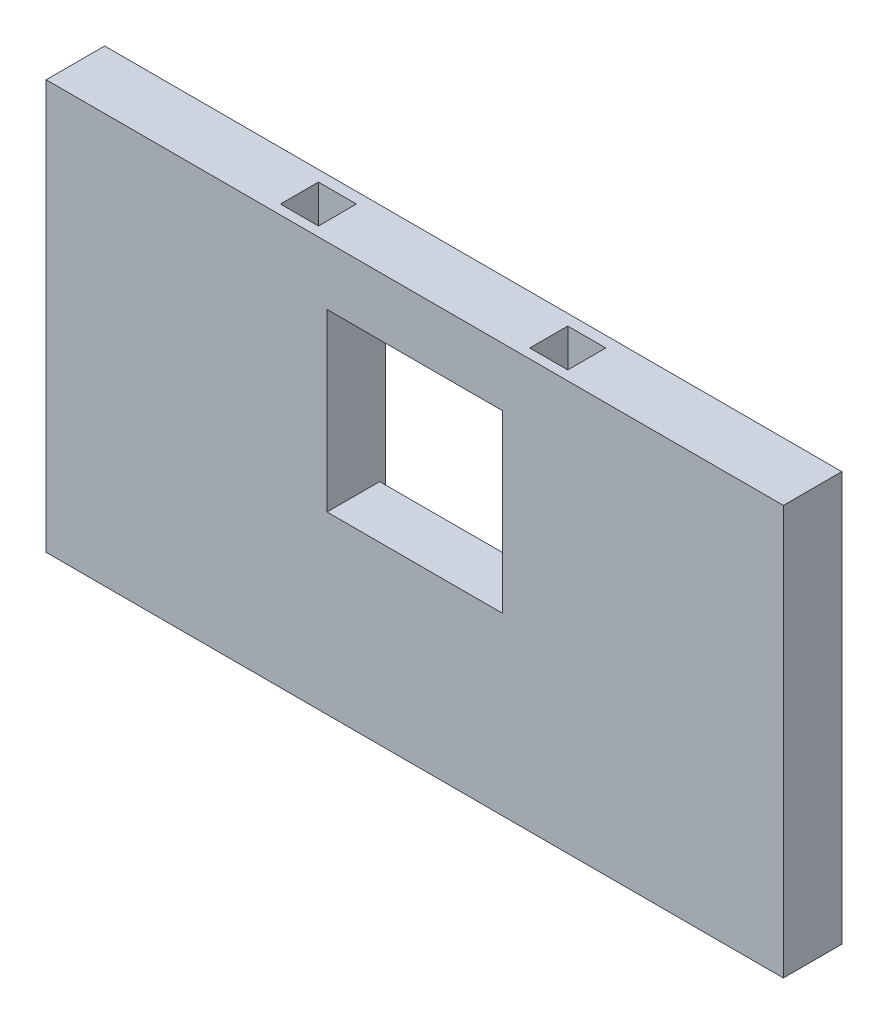
ISO-10303-21;
HEADER;
FILE_DESCRIPTION(('STEP AP214'),'2;1');
FILE_NAME('part.step','',(''),(''),'','','');
FILE_SCHEMA(('AUTOMOTIVE_DESIGN { 1 0 10303 214 1 1 1 1 }'));
ENDSEC;
DATA;
#1=APPLICATION_CONTEXT('core data for automotive mechanical design processes');
#2=APPLICATION_PROTOCOL_DEFINITION('international standard','automotive_design',2000,#1);
#3=PRODUCT_CONTEXT('',#1,'mechanical');
#4=PRODUCT('Part','Part','',(#3));
#5=PRODUCT_RELATED_PRODUCT_CATEGORY('part','',(#4));
#6=PRODUCT_DEFINITION_FORMATION('','',#4);
#7=PRODUCT_DEFINITION_CONTEXT('part definition',#1,'design');
#8=PRODUCT_DEFINITION('design','',#6,#7);
#9=PRODUCT_DEFINITION_SHAPE('','',#8);
#10=(LENGTH_UNIT() NAMED_UNIT(*) SI_UNIT(.MILLI.,.METRE.));
#11=(NAMED_UNIT(*) PLANE_ANGLE_UNIT() SI_UNIT($,.RADIAN.));
#12=(NAMED_UNIT(*) SI_UNIT($,.STERADIAN.) SOLID_ANGLE_UNIT());
#13=UNCERTAINTY_MEASURE_WITH_UNIT(LENGTH_MEASURE(1.E-05),#10,'distance_accuracy_value','');
#14=(GEOMETRIC_REPRESENTATION_CONTEXT(3) GLOBAL_UNCERTAINTY_ASSIGNED_CONTEXT((#13)) GLOBAL_UNIT_ASSIGNED_CONTEXT((#10,
#11,#12)) REPRESENTATION_CONTEXT('',''));
#15=CARTESIAN_POINT('',(0.,0.,0.));
#16=DIRECTION('',(0.,0.,1.));
#17=DIRECTION('',(1.,0.,0.));
#18=AXIS2_PLACEMENT_3D('',#15,#16,#17);
#19=CARTESIAN_POINT('',(-26.742581767651,12.0903954802261,-20.));
#20=DIRECTION('',(0.,-1.,0.));
#21=DIRECTION('',(1.,0.,0.));
#22=AXIS2_PLACEMENT_3D('',#19,#20,#21);
#23=PLANE('',#22);
#24=DIRECTION('',(1.,0.,0.));
#25=VECTOR('',#24,1.);
#26=CARTESIAN_POINT('',(-157.198241582885,12.0903954802261,2.));
#27=LINE('',#26,#25);
#28=CARTESIAN_POINT('',(-86.742581767651,12.0903954802261,2.));
#29=VERTEX_POINT('',#28);
#30=CARTESIAN_POINT('',(-26.7425817676511,12.0903954802261,2.));
#31=VERTEX_POINT('',#30);
#32=EDGE_CURVE('E228',#29,#31,#27,.T.);
#33=ORIENTED_EDGE('',*,*,#32,.F.);
#34=DIRECTION('',(0.,0.,1.));
#35=VECTOR('',#34,1.);
#36=CARTESIAN_POINT('',(-86.742581767651,12.090395480226,-20.));
#37=LINE('',#36,#35);
#38=CARTESIAN_POINT('',(-86.742581767651,12.090395480226,20.));
#39=VERTEX_POINT('',#38);
#40=EDGE_CURVE('E235',#29,#39,#37,.T.);
#41=ORIENTED_EDGE('',*,*,#40,.T.);
#42=DIRECTION('',(1.,0.,0.));
#43=VECTOR('',#42,1.);
#44=CARTESIAN_POINT('',(-26.742581767651,12.0903954802261,20.));
#45=LINE('',#44,#43);
#46=CARTESIAN_POINT('',(-26.742581767651,12.0903954802261,20.));
#47=VERTEX_POINT('',#46);
#48=EDGE_CURVE('E176',#39,#47,#45,.T.);
#49=ORIENTED_EDGE('',*,*,#48,.T.);
#50=DIRECTION('',(0.,0.,1.));
#51=VECTOR('',#50,1.);
#52=CARTESIAN_POINT('',(-26.742581767651,12.0903954802261,-20.));
#53=LINE('',#52,#51);
#54=EDGE_CURVE('E171',#31,#47,#53,.T.);
#55=ORIENTED_EDGE('',*,*,#54,.F.);
#56=EDGE_LOOP('',(#33,#41,#49,#55));
#57=FACE_BOUND('',#56,.T.);
#58=ADVANCED_FACE('F33',(#57),#23,.F.);
#59=CARTESIAN_POINT('',(-182.821386225128,92.090395480226,20.));
#60=DIRECTION('',(1.,0.,0.));
#61=DIRECTION('',(0.,0.,-1.));
#62=AXIS2_PLACEMENT_3D('',#59,#60,#61);
#63=PLANE('',#62);
#64=DIRECTION('',(0.,-1.,0.));
#65=VECTOR('',#64,1.);
#66=CARTESIAN_POINT('',(-182.821386225128,92.090395480226,0.));
#67=LINE('',#66,#65);
#68=CARTESIAN_POINT('',(-182.821386225128,92.090395480226,0.));
#69=VERTEX_POINT('',#68);
#70=CARTESIAN_POINT('',(-182.821386225128,-47.909604519774,0.));
#71=VERTEX_POINT('',#70);
#72=EDGE_CURVE('E303',#69,#71,#67,.T.);
#73=ORIENTED_EDGE('',*,*,#72,.T.);
#74=DIRECTION('',(0.,0.,1.));
#75=VECTOR('',#74,1.);
#76=CARTESIAN_POINT('',(-182.821386225128,-47.909604519774,-34.));
#77=LINE('',#76,#75);
#78=CARTESIAN_POINT('',(-182.821386225128,-47.909604519774,20.));
#79=VERTEX_POINT('',#78);
#80=EDGE_CURVE('E210',#71,#79,#77,.T.);
#81=ORIENTED_EDGE('',*,*,#80,.T.);
#82=DIRECTION('',(0.,-1.,0.));
#83=VECTOR('',#82,1.);
#84=CARTESIAN_POINT('',(-182.821386225128,92.090395480226,20.));
#85=LINE('',#84,#83);
#86=CARTESIAN_POINT('',(-182.821386225128,92.090395480226,20.));
#87=VERTEX_POINT('',#86);
#88=EDGE_CURVE('E312',#87,#79,#85,.T.);
#89=ORIENTED_EDGE('',*,*,#88,.F.);
#90=DIRECTION('',(0.,0.,-1.));
#91=VECTOR('',#90,1.);
#92=CARTESIAN_POINT('',(-182.821386225128,92.090395480226,20.));
#93=LINE('',#92,#91);
#94=EDGE_CURVE('E316',#87,#69,#93,.T.);
#95=ORIENTED_EDGE('',*,*,#94,.T.);
#96=EDGE_LOOP('',(#73,#81,#89,#95));
#97=FACE_BOUND('',#96,.T.);
#98=ADVANCED_FACE('F35',(#97),#63,.F.);
#99=CARTESIAN_POINT('',(-107.821386225128,92.090395480226,20.));
#100=DIRECTION('',(0.,-1.,0.));
#101=DIRECTION('',(1.,0.,0.));
#102=AXIS2_PLACEMENT_3D('',#99,#100,#101);
#103=PLANE('',#102);
#104=DIRECTION('',(-1.,0.,0.));
#105=VECTOR('',#104,1.);
#106=CARTESIAN_POINT('',(-7.66377731017402,92.090395480226,3.75));
#107=LINE('',#106,#105);
#108=CARTESIAN_POINT('',(-7.66377731017402,92.090395480226,3.75));
#109=VERTEX_POINT('',#108);
#110=CARTESIAN_POINT('',(-20.663777310174,92.090395480226,3.75));
#111=VERTEX_POINT('',#110);
#112=EDGE_CURVE('E261',#109,#111,#107,.T.);
#113=ORIENTED_EDGE('',*,*,#112,.F.);
#114=DIRECTION('',(0.,0.,-1.));
#115=VECTOR('',#114,1.);
#116=CARTESIAN_POINT('',(-7.66377731017402,92.090395480226,3.75));
#117=LINE('',#116,#115);
#118=CARTESIAN_POINT('',(-7.66377731017402,92.090395480226,16.75));
#119=VERTEX_POINT('',#118);
#120=EDGE_CURVE('E244',#119,#109,#117,.T.);
#121=ORIENTED_EDGE('',*,*,#120,.F.);
#122=DIRECTION('',(1.,0.,0.));
#123=VECTOR('',#122,1.);
#124=CARTESIAN_POINT('',(-7.66377731017402,92.090395480226,16.75));
#125=LINE('',#124,#123);
#126=CARTESIAN_POINT('',(-20.663777310174,92.090395480226,16.75));
#127=VERTEX_POINT('',#126);
#128=EDGE_CURVE('E250',#127,#119,#125,.T.);
#129=ORIENTED_EDGE('',*,*,#128,.F.);
#130=DIRECTION('',(0.,0.,1.));
#131=VECTOR('',#130,1.);
#132=CARTESIAN_POINT('',(-20.663777310174,92.090395480226,3.75));
#133=LINE('',#132,#131);
#134=EDGE_CURVE('E264',#111,#127,#133,.T.);
#135=ORIENTED_EDGE('',*,*,#134,.F.);
#136=EDGE_LOOP('',(#113,#121,#129,#135));
#137=FACE_BOUND('',#136,.T.);
#138=DIRECTION('',(-1.,0.,0.));
#139=VECTOR('',#138,1.);
#140=CARTESIAN_POINT('',(-107.821386225128,92.090395480226,0.));
#141=LINE('',#140,#139);
#142=CARTESIAN_POINT('',(69.336222689826,92.0903954802261,0.));
#143=VERTEX_POINT('',#142);
#144=EDGE_CURVE('E313',#143,#69,#141,.T.);
#145=ORIENTED_EDGE('',*,*,#144,.T.);
#146=ORIENTED_EDGE('',*,*,#94,.F.);
#147=DIRECTION('',(-1.,0.,0.));
#148=VECTOR('',#147,1.);
#149=CARTESIAN_POINT('',(-107.821386225128,92.090395480226,20.));
#150=LINE('',#149,#148);
#151=CARTESIAN_POINT('',(69.336222689826,92.0903954802261,20.));
#152=VERTEX_POINT('',#151);
#153=EDGE_CURVE('E310',#152,#87,#150,.T.);
#154=ORIENTED_EDGE('',*,*,#153,.F.);
#155=DIRECTION('',(0.,0.,1.));
#156=VECTOR('',#155,1.);
#157=CARTESIAN_POINT('',(69.336222689826,92.0903954802261,20.));
#158=LINE('',#157,#156);
#159=EDGE_CURVE('E237',#143,#152,#158,.T.);
#160=ORIENTED_EDGE('',*,*,#159,.F.);
#161=EDGE_LOOP('',(#145,#146,#154,#160));
#162=FACE_BOUND('',#161,.T.);
#163=DIRECTION('',(1.,0.,0.));
#164=VECTOR('',#163,1.);
#165=CARTESIAN_POINT('',(-105.941386225128,92.090395480226,16.75));
#166=LINE('',#165,#164);
#167=CARTESIAN_POINT('',(-105.941386225128,92.090395480226,16.75));
#168=VERTEX_POINT('',#167);
#169=CARTESIAN_POINT('',(-92.9413862251281,92.090395480226,16.75));
#170=VERTEX_POINT('',#169);
#171=EDGE_CURVE('E293',#168,#170,#166,.T.);
#172=ORIENTED_EDGE('',*,*,#171,.F.);
#173=DIRECTION('',(0.,0.,1.));
#174=VECTOR('',#173,1.);
#175=CARTESIAN_POINT('',(-105.941386225128,92.090395480226,3.75));
#176=LINE('',#175,#174);
#177=CARTESIAN_POINT('',(-105.941386225128,92.090395480226,3.75));
#178=VERTEX_POINT('',#177);
#179=EDGE_CURVE('E271',#178,#168,#176,.T.);
#180=ORIENTED_EDGE('',*,*,#179,.F.);
#181=DIRECTION('',(-1.,0.,0.));
#182=VECTOR('',#181,1.);
#183=CARTESIAN_POINT('',(-105.941386225128,92.090395480226,3.75));
#184=LINE('',#183,#182);
#185=CARTESIAN_POINT('',(-92.9413862251281,92.090395480226,3.75));
#186=VERTEX_POINT('',#185);
#187=EDGE_CURVE('E282',#186,#178,#184,.T.);
#188=ORIENTED_EDGE('',*,*,#187,.F.);
#189=DIRECTION('',(0.,0.,-1.));
#190=VECTOR('',#189,1.);
#191=CARTESIAN_POINT('',(-92.9413862251281,92.090395480226,3.75));
#192=LINE('',#191,#190);
#193=EDGE_CURVE('E296',#170,#186,#192,.T.);
#194=ORIENTED_EDGE('',*,*,#193,.F.);
#195=EDGE_LOOP('',(#172,#180,#188,#194));
#196=FACE_BOUND('',#195,.T.);
#197=ADVANCED_FACE('F350',(#137,#162,#196),#103,.F.);
#198=CARTESIAN_POINT('',(0.,0.,20.));
#199=DIRECTION('',(0.,0.,1.));
#200=DIRECTION('',(1.,0.,0.));
#201=AXIS2_PLACEMENT_3D('',#198,#199,#200);
#202=PLANE('',#201);
#203=DIRECTION('',(0.,-1.,0.));
#204=VECTOR('',#203,1.);
#205=CARTESIAN_POINT('',(-86.742581767651,62.090395480226,20.));
#206=LINE('',#205,#204);
#207=CARTESIAN_POINT('',(-86.742581767651,72.090395480226,20.));
#208=VERTEX_POINT('',#207);
#209=EDGE_CURVE('E55',#208,#39,#206,.T.);
#210=ORIENTED_EDGE('',*,*,#209,.F.);
#211=DIRECTION('',(-1.,0.,0.));
#212=VECTOR('',#211,1.);
#213=CARTESIAN_POINT('',(-86.742581767651,72.090395480226,20.));
#214=LINE('',#213,#212);
#215=CARTESIAN_POINT('',(-26.7425817676511,72.090395480226,20.));
#216=VERTEX_POINT('',#215);
#217=EDGE_CURVE('E184',#216,#208,#214,.T.);
#218=ORIENTED_EDGE('',*,*,#217,.F.);
#219=DIRECTION('',(0.,1.,0.));
#220=VECTOR('',#219,1.);
#221=CARTESIAN_POINT('',(-26.7425817676511,62.090395480226,20.));
#222=LINE('',#221,#220);
#223=EDGE_CURVE('E165',#47,#216,#222,.T.);
#224=ORIENTED_EDGE('',*,*,#223,.F.);
#225=ORIENTED_EDGE('',*,*,#48,.F.);
#226=EDGE_LOOP('',(#210,#218,#224,#225));
#227=FACE_BOUND('',#226,.T.);
#228=DIRECTION('',(-1.,0.,0.));
#229=VECTOR('',#228,1.);
#230=CARTESIAN_POINT('',(69.336222689826,-47.909604519774,20.));
#231=LINE('',#230,#229);
#232=CARTESIAN_POINT('',(69.336222689826,-47.909604519774,20.));
#233=VERTEX_POINT('',#232);
#234=EDGE_CURVE('E207',#233,#79,#231,.T.);
#235=ORIENTED_EDGE('',*,*,#234,.F.);
#236=DIRECTION('',(0.,1.,0.));
#237=VECTOR('',#236,1.);
#238=CARTESIAN_POINT('',(69.336222689826,-57.909604519774,20.));
#239=LINE('',#238,#237);
#240=EDGE_CURVE('E241',#233,#152,#239,.T.);
#241=ORIENTED_EDGE('',*,*,#240,.T.);
#242=ORIENTED_EDGE('',*,*,#153,.T.);
#243=ORIENTED_EDGE('',*,*,#88,.T.);
#244=EDGE_LOOP('',(#235,#241,#242,#243));
#245=FACE_BOUND('',#244,.T.);
#246=ADVANCED_FACE('F189',(#227,#245),#202,.T.);
#247=CARTESIAN_POINT('',(0.,0.,0.));
#248=DIRECTION('',(0.,0.,1.));
#249=DIRECTION('',(1.,0.,0.));
#250=AXIS2_PLACEMENT_3D('',#247,#248,#249);
#251=PLANE('',#250);
#252=DIRECTION('',(1.,0.,0.));
#253=VECTOR('',#252,1.);
#254=CARTESIAN_POINT('',(-86.742581767651,72.090395480226,0.));
#255=LINE('',#254,#253);
#256=CARTESIAN_POINT('',(-86.742581767651,72.090395480226,0.));
#257=VERTEX_POINT('',#256);
#258=CARTESIAN_POINT('',(-26.7425817676511,72.090395480226,0.));
#259=VERTEX_POINT('',#258);
#260=EDGE_CURVE('E186',#257,#259,#255,.T.);
#261=ORIENTED_EDGE('',*,*,#260,.F.);
#262=DIRECTION('',(0.,-1.,0.));
#263=VECTOR('',#262,1.);
#264=CARTESIAN_POINT('',(-86.742581767651,0.,0.));
#265=LINE('',#264,#263);
#266=CARTESIAN_POINT('',(-86.742581767651,-47.909604519774,0.));
#267=VERTEX_POINT('',#266);
#268=EDGE_CURVE('E324',#257,#267,#265,.T.);
#269=ORIENTED_EDGE('',*,*,#268,.T.);
#270=DIRECTION('',(-1.,0.,0.));
#271=VECTOR('',#270,1.);
#272=CARTESIAN_POINT('',(0.,-47.909604519774,0.));
#273=LINE('',#272,#271);
#274=EDGE_CURVE('E218',#267,#71,#273,.T.);
#275=ORIENTED_EDGE('',*,*,#274,.T.);
#276=ORIENTED_EDGE('',*,*,#72,.F.);
#277=ORIENTED_EDGE('',*,*,#144,.F.);
#278=DIRECTION('',(0.,1.,0.));
#279=VECTOR('',#278,1.);
#280=CARTESIAN_POINT('',(69.336222689826,-57.909604519774,0.));
#281=LINE('',#280,#279);
#282=CARTESIAN_POINT('',(69.336222689826,-47.909604519774,0.));
#283=VERTEX_POINT('',#282);
#284=EDGE_CURVE('E242',#283,#143,#281,.T.);
#285=ORIENTED_EDGE('',*,*,#284,.F.);
#286=CARTESIAN_POINT('',(-26.7425817676511,-47.909604519774,0.));
#287=VERTEX_POINT('',#286);
#288=EDGE_CURVE('E221',#283,#287,#273,.T.);
#289=ORIENTED_EDGE('',*,*,#288,.T.);
#290=DIRECTION('',(0.,1.,0.));
#291=VECTOR('',#290,1.);
#292=CARTESIAN_POINT('',(-26.7425817676511,0.,0.));
#293=LINE('',#292,#291);
#294=EDGE_CURVE('E322',#287,#259,#293,.T.);
#295=ORIENTED_EDGE('',*,*,#294,.T.);
#296=EDGE_LOOP('',(#261,#269,#275,#276,#277,#285,#289,#295));
#297=FACE_BOUND('',#296,.T.);
#298=ADVANCED_FACE('F341',(#297),#251,.F.);
#299=CARTESIAN_POINT('',(-105.941386225128,76.590395480226,3.75));
#300=DIRECTION('',(-1.,0.,0.));
#301=DIRECTION('',(0.,-1.,0.));
#302=AXIS2_PLACEMENT_3D('',#299,#300,#301);
#303=PLANE('',#302);
#304=ORIENTED_EDGE('',*,*,#179,.T.);
#305=DIRECTION('',(0.,1.,0.));
#306=VECTOR('',#305,1.);
#307=CARTESIAN_POINT('',(-105.941386225128,76.590395480226,16.75));
#308=LINE('',#307,#306);
#309=CARTESIAN_POINT('',(-105.941386225128,76.590395480226,16.75));
#310=VERTEX_POINT('',#309);
#311=EDGE_CURVE('E291',#310,#168,#308,.T.);
#312=ORIENTED_EDGE('',*,*,#311,.F.);
#313=DIRECTION('',(0.,0.,1.));
#314=VECTOR('',#313,1.);
#315=CARTESIAN_POINT('',(-105.941386225128,76.590395480226,3.75));
#316=LINE('',#315,#314);
#317=CARTESIAN_POINT('',(-105.941386225128,76.590395480226,3.75));
#318=VERTEX_POINT('',#317);
#319=EDGE_CURVE('E278',#318,#310,#316,.T.);
#320=ORIENTED_EDGE('',*,*,#319,.F.);
#321=DIRECTION('',(0.,1.,0.));
#322=VECTOR('',#321,1.);
#323=CARTESIAN_POINT('',(-105.941386225128,76.590395480226,3.75));
#324=LINE('',#323,#322);
#325=EDGE_CURVE('E301',#318,#178,#324,.T.);
#326=ORIENTED_EDGE('',*,*,#325,.T.);
#327=EDGE_LOOP('',(#304,#312,#320,#326));
#328=FACE_BOUND('',#327,.T.);
#329=ADVANCED_FACE('F397',(#328),#303,.F.);
#330=CARTESIAN_POINT('',(-105.941386225128,76.590395480226,3.75));
#331=DIRECTION('',(0.,0.,-1.));
#332=DIRECTION('',(-1.,0.,0.));
#333=AXIS2_PLACEMENT_3D('',#330,#331,#332);
#334=PLANE('',#333);
#335=ORIENTED_EDGE('',*,*,#187,.T.);
#336=ORIENTED_EDGE('',*,*,#325,.F.);
#337=DIRECTION('',(-1.,0.,0.));
#338=VECTOR('',#337,1.);
#339=CARTESIAN_POINT('',(-105.941386225128,76.590395480226,3.75));
#340=LINE('',#339,#338);
#341=CARTESIAN_POINT('',(-92.9413862251281,76.590395480226,3.75));
#342=VERTEX_POINT('',#341);
#343=EDGE_CURVE('E288',#342,#318,#340,.T.);
#344=ORIENTED_EDGE('',*,*,#343,.F.);
#345=DIRECTION('',(0.,1.,0.));
#346=VECTOR('',#345,1.);
#347=CARTESIAN_POINT('',(-92.9413862251281,76.590395480226,3.75));
#348=LINE('',#347,#346);
#349=EDGE_CURVE('E304',#342,#186,#348,.T.);
#350=ORIENTED_EDGE('',*,*,#349,.T.);
#351=EDGE_LOOP('',(#335,#336,#344,#350));
#352=FACE_BOUND('',#351,.T.);
#353=ADVANCED_FACE('F393',(#352),#334,.F.);
#354=CARTESIAN_POINT('',(-92.9413862251281,76.590395480226,3.75));
#355=DIRECTION('',(1.,0.,0.));
#356=DIRECTION('',(0.,1.,0.));
#357=AXIS2_PLACEMENT_3D('',#354,#355,#356);
#358=PLANE('',#357);
#359=ORIENTED_EDGE('',*,*,#193,.T.);
#360=ORIENTED_EDGE('',*,*,#349,.F.);
#361=DIRECTION('',(0.,0.,-1.));
#362=VECTOR('',#361,1.);
#363=CARTESIAN_POINT('',(-92.9413862251281,76.590395480226,3.75));
#364=LINE('',#363,#362);
#365=CARTESIAN_POINT('',(-92.9413862251281,76.590395480226,16.75));
#366=VERTEX_POINT('',#365);
#367=EDGE_CURVE('E285',#366,#342,#364,.T.);
#368=ORIENTED_EDGE('',*,*,#367,.F.);
#369=DIRECTION('',(0.,1.,0.));
#370=VECTOR('',#369,1.);
#371=CARTESIAN_POINT('',(-92.9413862251281,76.590395480226,16.75));
#372=LINE('',#371,#370);
#373=EDGE_CURVE('E306',#366,#170,#372,.T.);
#374=ORIENTED_EDGE('',*,*,#373,.T.);
#375=EDGE_LOOP('',(#359,#360,#368,#374));
#376=FACE_BOUND('',#375,.T.);
#377=ADVANCED_FACE('F396',(#376),#358,.F.);
#378=CARTESIAN_POINT('',(-105.941386225128,76.590395480226,16.75));
#379=DIRECTION('',(0.,0.,1.));
#380=DIRECTION('',(1.,0.,0.));
#381=AXIS2_PLACEMENT_3D('',#378,#379,#380);
#382=PLANE('',#381);
#383=ORIENTED_EDGE('',*,*,#171,.T.);
#384=ORIENTED_EDGE('',*,*,#373,.F.);
#385=DIRECTION('',(1.,0.,0.));
#386=VECTOR('',#385,1.);
#387=CARTESIAN_POINT('',(-105.941386225128,76.590395480226,16.75));
#388=LINE('',#387,#386);
#389=EDGE_CURVE('E281',#310,#366,#388,.T.);
#390=ORIENTED_EDGE('',*,*,#389,.F.);
#391=ORIENTED_EDGE('',*,*,#311,.T.);
#392=EDGE_LOOP('',(#383,#384,#390,#391));
#393=FACE_BOUND('',#392,.T.);
#394=ADVANCED_FACE('F391',(#393),#382,.F.);
#395=CARTESIAN_POINT('',(0.,76.590395480226,0.));
#396=DIRECTION('',(0.,1.,0.));
#397=DIRECTION('',(0.,0.,1.));
#398=AXIS2_PLACEMENT_3D('',#395,#396,#397);
#399=PLANE('',#398);
#400=ORIENTED_EDGE('',*,*,#319,.T.);
#401=ORIENTED_EDGE('',*,*,#389,.T.);
#402=ORIENTED_EDGE('',*,*,#367,.T.);
#403=ORIENTED_EDGE('',*,*,#343,.T.);
#404=EDGE_LOOP('',(#400,#401,#402,#403));
#405=FACE_BOUND('',#404,.T.);
#406=ADVANCED_FACE('F387',(#405),#399,.T.);
#407=CARTESIAN_POINT('',(-7.66377731017401,76.590395480226,3.75));
#408=DIRECTION('',(1.,0.,0.));
#409=DIRECTION('',(0.,1.,0.));
#410=AXIS2_PLACEMENT_3D('',#407,#408,#409);
#411=PLANE('',#410);
#412=ORIENTED_EDGE('',*,*,#120,.T.);
#413=DIRECTION('',(0.,1.,0.));
#414=VECTOR('',#413,1.);
#415=CARTESIAN_POINT('',(-7.66377731017401,76.590395480226,3.75));
#416=LINE('',#415,#414);
#417=CARTESIAN_POINT('',(-7.66377731017401,76.590395480226,3.75));
#418=VERTEX_POINT('',#417);
#419=EDGE_CURVE('E259',#418,#109,#416,.T.);
#420=ORIENTED_EDGE('',*,*,#419,.F.);
#421=DIRECTION('',(0.,0.,-1.));
#422=VECTOR('',#421,1.);
#423=CARTESIAN_POINT('',(-7.66377731017401,76.590395480226,3.75));
#424=LINE('',#423,#422);
#425=CARTESIAN_POINT('',(-7.66377731017401,76.590395480226,16.75));
#426=VERTEX_POINT('',#425);
#427=EDGE_CURVE('E246',#426,#418,#424,.T.);
#428=ORIENTED_EDGE('',*,*,#427,.F.);
#429=DIRECTION('',(0.,1.,0.));
#430=VECTOR('',#429,1.);
#431=CARTESIAN_POINT('',(-7.66377731017401,76.590395480226,16.75));
#432=LINE('',#431,#430);
#433=EDGE_CURVE('E269',#426,#119,#432,.T.);
#434=ORIENTED_EDGE('',*,*,#433,.T.);
#435=EDGE_LOOP('',(#412,#420,#428,#434));
#436=FACE_BOUND('',#435,.T.);
#437=ADVANCED_FACE('F377',(#436),#411,.F.);
#438=CARTESIAN_POINT('',(-7.66377731017401,76.590395480226,16.75));
#439=DIRECTION('',(0.,0.,1.));
#440=DIRECTION('',(1.,0.,0.));
#441=AXIS2_PLACEMENT_3D('',#438,#439,#440);
#442=PLANE('',#441);
#443=ORIENTED_EDGE('',*,*,#128,.T.);
#444=ORIENTED_EDGE('',*,*,#433,.F.);
#445=DIRECTION('',(1.,0.,0.));
#446=VECTOR('',#445,1.);
#447=CARTESIAN_POINT('',(-7.66377731017401,76.590395480226,16.75));
#448=LINE('',#447,#446);
#449=CARTESIAN_POINT('',(-20.663777310174,76.590395480226,16.75));
#450=VERTEX_POINT('',#449);
#451=EDGE_CURVE('E256',#450,#426,#448,.T.);
#452=ORIENTED_EDGE('',*,*,#451,.F.);
#453=DIRECTION('',(0.,1.,0.));
#454=VECTOR('',#453,1.);
#455=CARTESIAN_POINT('',(-20.663777310174,76.590395480226,16.75));
#456=LINE('',#455,#454);
#457=EDGE_CURVE('E272',#450,#127,#456,.T.);
#458=ORIENTED_EDGE('',*,*,#457,.T.);
#459=EDGE_LOOP('',(#443,#444,#452,#458));
#460=FACE_BOUND('',#459,.T.);
#461=ADVANCED_FACE('F373',(#460),#442,.F.);
#462=CARTESIAN_POINT('',(-20.663777310174,76.590395480226,3.75));
#463=DIRECTION('',(-1.,0.,0.));
#464=DIRECTION('',(0.,-1.,0.));
#465=AXIS2_PLACEMENT_3D('',#462,#463,#464);
#466=PLANE('',#465);
#467=ORIENTED_EDGE('',*,*,#134,.T.);
#468=ORIENTED_EDGE('',*,*,#457,.F.);
#469=DIRECTION('',(0.,0.,1.));
#470=VECTOR('',#469,1.);
#471=CARTESIAN_POINT('',(-20.663777310174,76.590395480226,3.75));
#472=LINE('',#471,#470);
#473=CARTESIAN_POINT('',(-20.663777310174,76.590395480226,3.75));
#474=VERTEX_POINT('',#473);
#475=EDGE_CURVE('E253',#474,#450,#472,.T.);
#476=ORIENTED_EDGE('',*,*,#475,.F.);
#477=DIRECTION('',(0.,1.,0.));
#478=VECTOR('',#477,1.);
#479=CARTESIAN_POINT('',(-20.663777310174,76.590395480226,3.75));
#480=LINE('',#479,#478);
#481=EDGE_CURVE('E274',#474,#111,#480,.T.);
#482=ORIENTED_EDGE('',*,*,#481,.T.);
#483=EDGE_LOOP('',(#467,#468,#476,#482));
#484=FACE_BOUND('',#483,.T.);
#485=ADVANCED_FACE('F376',(#484),#466,.F.);
#486=CARTESIAN_POINT('',(-7.66377731017401,76.590395480226,3.75));
#487=DIRECTION('',(0.,0.,-1.));
#488=DIRECTION('',(-1.,0.,0.));
#489=AXIS2_PLACEMENT_3D('',#486,#487,#488);
#490=PLANE('',#489);
#491=ORIENTED_EDGE('',*,*,#112,.T.);
#492=ORIENTED_EDGE('',*,*,#481,.F.);
#493=DIRECTION('',(-1.,0.,0.));
#494=VECTOR('',#493,1.);
#495=CARTESIAN_POINT('',(-7.66377731017401,76.590395480226,3.75));
#496=LINE('',#495,#494);
#497=EDGE_CURVE('E249',#418,#474,#496,.T.);
#498=ORIENTED_EDGE('',*,*,#497,.F.);
#499=ORIENTED_EDGE('',*,*,#419,.T.);
#500=EDGE_LOOP('',(#491,#492,#498,#499));
#501=FACE_BOUND('',#500,.T.);
#502=ADVANCED_FACE('F371',(#501),#490,.F.);
#503=CARTESIAN_POINT('',(0.,76.590395480226,0.));
#504=DIRECTION('',(0.,-1.,0.));
#505=DIRECTION('',(0.,0.,-1.));
#506=AXIS2_PLACEMENT_3D('',#503,#504,#505);
#507=PLANE('',#506);
#508=ORIENTED_EDGE('',*,*,#427,.T.);
#509=ORIENTED_EDGE('',*,*,#497,.T.);
#510=ORIENTED_EDGE('',*,*,#475,.T.);
#511=ORIENTED_EDGE('',*,*,#451,.T.);
#512=EDGE_LOOP('',(#508,#509,#510,#511));
#513=FACE_BOUND('',#512,.T.);
#514=ADVANCED_FACE('F368',(#513),#507,.F.);
#515=CARTESIAN_POINT('',(69.336222689826,-57.909604519774,20.));
#516=DIRECTION('',(-1.,0.,0.));
#517=DIRECTION('',(0.,-1.,0.));
#518=AXIS2_PLACEMENT_3D('',#515,#516,#517);
#519=PLANE('',#518);
#520=ORIENTED_EDGE('',*,*,#240,.F.);
#521=DIRECTION('',(0.,0.,1.));
#522=VECTOR('',#521,1.);
#523=CARTESIAN_POINT('',(69.336222689826,-47.909604519774,-34.));
#524=LINE('',#523,#522);
#525=EDGE_CURVE('E209',#283,#233,#524,.T.);
#526=ORIENTED_EDGE('',*,*,#525,.F.);
#527=ORIENTED_EDGE('',*,*,#284,.T.);
#528=ORIENTED_EDGE('',*,*,#159,.T.);
#529=EDGE_LOOP('',(#520,#526,#527,#528));
#530=FACE_BOUND('',#529,.T.);
#531=ADVANCED_FACE('F347',(#530),#519,.F.);
#532=CARTESIAN_POINT('',(-86.742581767651,62.090395480226,-20.));
#533=DIRECTION('',(-1.,0.,0.));
#534=DIRECTION('',(0.,0.,1.));
#535=AXIS2_PLACEMENT_3D('',#532,#533,#534);
#536=PLANE('',#535);
#537=DIRECTION('',(0.,0.,-1.));
#538=VECTOR('',#537,1.);
#539=CARTESIAN_POINT('',(-86.742581767651,-47.909604519774,-20.));
#540=LINE('',#539,#538);
#541=CARTESIAN_POINT('',(-86.742581767651,-47.909604519774,3.71428571428572));
#542=VERTEX_POINT('',#541);
#543=EDGE_CURVE('E48',#542,#267,#540,.T.);
#544=ORIENTED_EDGE('',*,*,#543,.T.);
#545=ORIENTED_EDGE('',*,*,#268,.F.);
#546=DIRECTION('',(0.,0.,1.));
#547=VECTOR('',#546,1.);
#548=CARTESIAN_POINT('',(-86.742581767651,72.090395480226,-61.014414867537));
#549=LINE('',#548,#547);
#550=EDGE_CURVE('E187',#257,#208,#549,.T.);
#551=ORIENTED_EDGE('',*,*,#550,.T.);
#552=ORIENTED_EDGE('',*,*,#209,.T.);
#553=ORIENTED_EDGE('',*,*,#40,.F.);
#554=DIRECTION('',(0.,0.996346649041751,-0.0854011413464358));
#555=VECTOR('',#554,1.);
#556=CARTESIAN_POINT('',(-86.742581767651,12.0903954802261,2.));
#557=LINE('',#556,#555);
#558=CARTESIAN_POINT('',(-86.742581767651,-7.909604519774,3.71428571428572));
#559=VERTEX_POINT('',#558);
#560=EDGE_CURVE('E229',#559,#29,#557,.T.);
#561=ORIENTED_EDGE('',*,*,#560,.F.);
#562=DIRECTION('',(0.,1.,0.));
#563=VECTOR('',#562,1.);
#564=CARTESIAN_POINT('',(-86.742581767651,-57.909604519774,3.71428571428572));
#565=LINE('',#564,#563);
#566=EDGE_CURVE('E224',#542,#559,#565,.T.);
#567=ORIENTED_EDGE('',*,*,#566,.F.);
#568=EDGE_LOOP('',(#544,#545,#551,#552,#553,#561,#567));
#569=FACE_BOUND('',#568,.T.);
#570=ADVANCED_FACE('F356',(#569),#536,.F.);
#571=CARTESIAN_POINT('',(-26.7425817676511,62.090395480226,-20.));
#572=DIRECTION('',(1.,0.,0.));
#573=DIRECTION('',(0.,0.,-1.));
#574=AXIS2_PLACEMENT_3D('',#571,#572,#573);
#575=PLANE('',#574);
#576=ORIENTED_EDGE('',*,*,#223,.T.);
#577=DIRECTION('',(0.,0.,1.));
#578=VECTOR('',#577,1.);
#579=CARTESIAN_POINT('',(-26.7425817676511,72.090395480226,-61.014414867537));
#580=LINE('',#579,#578);
#581=EDGE_CURVE('E169',#259,#216,#580,.T.);
#582=ORIENTED_EDGE('',*,*,#581,.F.);
#583=ORIENTED_EDGE('',*,*,#294,.F.);
#584=DIRECTION('',(0.,0.,1.));
#585=VECTOR('',#584,1.);
#586=CARTESIAN_POINT('',(-26.7425817676511,-47.909604519774,-20.));
#587=LINE('',#586,#585);
#588=CARTESIAN_POINT('',(-26.7425817676511,-47.909604519774,3.71428571428572));
#589=VERTEX_POINT('',#588);
#590=EDGE_CURVE('E213',#287,#589,#587,.T.);
#591=ORIENTED_EDGE('',*,*,#590,.T.);
#592=DIRECTION('',(0.,1.,0.));
#593=VECTOR('',#592,1.);
#594=CARTESIAN_POINT('',(-26.7425817676511,-57.909604519774,3.71428571428572));
#595=LINE('',#594,#593);
#596=CARTESIAN_POINT('',(-26.7425817676511,-7.909604519774,3.71428571428572));
#597=VERTEX_POINT('',#596);
#598=EDGE_CURVE('E222',#589,#597,#595,.T.);
#599=ORIENTED_EDGE('',*,*,#598,.T.);
#600=DIRECTION('',(0.,0.996346649041751,-0.0854011413464358));
#601=VECTOR('',#600,1.);
#602=CARTESIAN_POINT('',(-26.7425817676511,12.0903954802261,2.));
#603=LINE('',#602,#601);
#604=EDGE_CURVE('E226',#597,#31,#603,.T.);
#605=ORIENTED_EDGE('',*,*,#604,.T.);
#606=ORIENTED_EDGE('',*,*,#54,.T.);
#607=EDGE_LOOP('',(#576,#582,#583,#591,#599,#605,#606));
#608=FACE_BOUND('',#607,.T.);
#609=ADVANCED_FACE('F167',(#608),#575,.F.);
#610=CARTESIAN_POINT('',(-157.198241582885,12.0903954802261,2.));
#611=DIRECTION('',(0.,-0.0854011413464358,-0.996346649041751));
#612=DIRECTION('',(0.,0.996346649041751,-0.0854011413464358));
#613=AXIS2_PLACEMENT_3D('',#610,#611,#612);
#614=PLANE('',#613);
#615=DIRECTION('',(1.,0.,0.));
#616=VECTOR('',#615,1.);
#617=CARTESIAN_POINT('',(-157.198241582885,-7.909604519774,3.71428571428572));
#618=LINE('',#617,#616);
#619=EDGE_CURVE('E41',#559,#597,#618,.T.);
#620=ORIENTED_EDGE('',*,*,#619,.F.);
#621=ORIENTED_EDGE('',*,*,#560,.T.);
#622=ORIENTED_EDGE('',*,*,#32,.T.);
#623=ORIENTED_EDGE('',*,*,#604,.F.);
#624=EDGE_LOOP('',(#620,#621,#622,#623));
#625=FACE_BOUND('',#624,.T.);
#626=ADVANCED_FACE('F334',(#625),#614,.T.);
#627=CARTESIAN_POINT('',(-86.742581767651,-57.909604519774,3.71428571428572));
#628=DIRECTION('',(0.,0.,1.));
#629=DIRECTION('',(1.,0.,0.));
#630=AXIS2_PLACEMENT_3D('',#627,#628,#629);
#631=PLANE('',#630);
#632=ORIENTED_EDGE('',*,*,#598,.F.);
#633=DIRECTION('',(-1.,0.,0.));
#634=VECTOR('',#633,1.);
#635=CARTESIAN_POINT('',(-86.742581767651,-47.909604519774,3.71428571428572));
#636=LINE('',#635,#634);
#637=EDGE_CURVE('E11',#589,#542,#636,.T.);
#638=ORIENTED_EDGE('',*,*,#637,.T.);
#639=ORIENTED_EDGE('',*,*,#566,.T.);
#640=ORIENTED_EDGE('',*,*,#619,.T.);
#641=EDGE_LOOP('',(#632,#638,#639,#640));
#642=FACE_BOUND('',#641,.T.);
#643=ADVANCED_FACE('F330',(#642),#631,.F.);
#644=CARTESIAN_POINT('',(69.336222689826,-47.909604519774,-34.));
#645=DIRECTION('',(0.,1.,0.));
#646=DIRECTION('',(-1.,0.,0.));
#647=AXIS2_PLACEMENT_3D('',#644,#645,#646);
#648=PLANE('',#647);
#649=ORIENTED_EDGE('',*,*,#525,.T.);
#650=ORIENTED_EDGE('',*,*,#234,.T.);
#651=ORIENTED_EDGE('',*,*,#80,.F.);
#652=ORIENTED_EDGE('',*,*,#274,.F.);
#653=ORIENTED_EDGE('',*,*,#543,.F.);
#654=ORIENTED_EDGE('',*,*,#637,.F.);
#655=ORIENTED_EDGE('',*,*,#590,.F.);
#656=ORIENTED_EDGE('',*,*,#288,.F.);
#657=EDGE_LOOP('',(#649,#650,#651,#652,#653,#654,#655,#656));
#658=FACE_BOUND('',#657,.T.);
#659=ADVANCED_FACE('F337',(#658),#648,.F.);
#660=CARTESIAN_POINT('',(-86.742581767651,72.090395480226,-61.014414867537));
#661=DIRECTION('',(0.,1.,0.));
#662=DIRECTION('',(0.,0.,1.));
#663=AXIS2_PLACEMENT_3D('',#660,#661,#662);
#664=PLANE('',#663);
#665=CARTESIAN_POINT('',(-47.3213862251281,72.090395480226,10.));
#666=DIRECTION('',(0.,1.,0.));
#667=DIRECTION('',(0.,0.,1.));
#668=AXIS2_PLACEMENT_3D('',#665,#666,#667);
#669=CIRCLE('',#668,5.25);
#670=CARTESIAN_POINT('',(-47.3213862251281,72.090395480226,15.25));
#671=VERTEX_POINT('',#670);
#672=EDGE_CURVE('E195',#671,#671,#669,.F.);
#673=ORIENTED_EDGE('',*,*,#672,.F.);
#674=EDGE_LOOP('',(#673));
#675=FACE_BOUND('',#674,.T.);
#676=ORIENTED_EDGE('',*,*,#260,.T.);
#677=ORIENTED_EDGE('',*,*,#581,.T.);
#678=ORIENTED_EDGE('',*,*,#217,.T.);
#679=ORIENTED_EDGE('',*,*,#550,.F.);
#680=EDGE_LOOP('',(#676,#677,#678,#679));
#681=FACE_BOUND('',#680,.T.);
#682=CARTESIAN_POINT('',(-66.3213862251281,72.090395480226,10.));
#683=DIRECTION('',(0.,1.,0.));
#684=DIRECTION('',(0.,0.,1.));
#685=AXIS2_PLACEMENT_3D('',#682,#683,#684);
#686=CIRCLE('',#685,5.25);
#687=CARTESIAN_POINT('',(-66.3213862251281,72.090395480226,15.25));
#688=VERTEX_POINT('',#687);
#689=EDGE_CURVE('E198',#688,#688,#686,.F.);
#690=ORIENTED_EDGE('',*,*,#689,.F.);
#691=EDGE_LOOP('',(#690));
#692=FACE_BOUND('',#691,.T.);
#693=ADVANCED_FACE('F181',(#675,#681,#692),#664,.F.);
#694=CARTESIAN_POINT('',(-66.3213862251281,72.090395480226,10.));
#695=DIRECTION('',(0.,1.,0.));
#696=DIRECTION('',(-1.,0.,0.));
#697=AXIS2_PLACEMENT_3D('',#694,#695,#696);
#698=CYLINDRICAL_SURFACE('',#697,5.25);
#699=CARTESIAN_POINT('',(-66.3213862251281,87.090395480226,10.));
#700=DIRECTION('',(0.,-1.,0.));
#701=DIRECTION('',(0.,0.,-1.));
#702=AXIS2_PLACEMENT_3D('',#699,#700,#701);
#703=CIRCLE('',#702,5.25);
#704=CARTESIAN_POINT('',(-66.3213862251281,87.090395480226,4.75));
#705=VERTEX_POINT('',#704);
#706=EDGE_CURVE('E204',#705,#705,#703,.F.);
#707=ORIENTED_EDGE('',*,*,#706,.T.);
#708=EDGE_LOOP('',(#707));
#709=FACE_BOUND('',#708,.T.);
#710=ORIENTED_EDGE('',*,*,#689,.T.);
#711=EDGE_LOOP('',(#710));
#712=FACE_BOUND('',#711,.T.);
#713=ADVANCED_FACE('F414',(#709,#712),#698,.F.);
#714=CARTESIAN_POINT('',(-26.742581767651,87.090395480226,-60.2079728939615));
#715=DIRECTION('',(0.,-1.,0.));
#716=DIRECTION('',(0.,0.,-1.));
#717=AXIS2_PLACEMENT_3D('',#714,#715,#716);
#718=PLANE('',#717);
#719=ORIENTED_EDGE('',*,*,#706,.F.);
#720=EDGE_LOOP('',(#719));
#721=FACE_BOUND('',#720,.T.);
#722=ADVANCED_FACE('F412',(#721),#718,.T.);
#723=CARTESIAN_POINT('',(-47.3213862251281,72.090395480226,10.));
#724=DIRECTION('',(0.,1.,0.));
#725=DIRECTION('',(-1.,0.,0.));
#726=AXIS2_PLACEMENT_3D('',#723,#724,#725);
#727=CYLINDRICAL_SURFACE('',#726,5.25);
#728=CARTESIAN_POINT('',(-47.3213862251281,87.090395480226,10.));
#729=DIRECTION('',(0.,-1.,0.));
#730=DIRECTION('',(0.,0.,-1.));
#731=AXIS2_PLACEMENT_3D('',#728,#729,#730);
#732=CIRCLE('',#731,5.25);
#733=CARTESIAN_POINT('',(-47.3213862251281,87.090395480226,4.75));
#734=VERTEX_POINT('',#733);
#735=EDGE_CURVE('E201',#734,#734,#732,.F.);
#736=ORIENTED_EDGE('',*,*,#735,.T.);
#737=EDGE_LOOP('',(#736));
#738=FACE_BOUND('',#737,.T.);
#739=ORIENTED_EDGE('',*,*,#672,.T.);
#740=EDGE_LOOP('',(#739));
#741=FACE_BOUND('',#740,.T.);
#742=ADVANCED_FACE('F408',(#738,#741),#727,.F.);
#743=ORIENTED_EDGE('',*,*,#735,.F.);
#744=EDGE_LOOP('',(#743));
#745=FACE_BOUND('',#744,.T.);
#746=ADVANCED_FACE('F411',(#745),#718,.T.);
#747=CLOSED_SHELL('',(#58,#98,#197,#246,#298,#329,#353,#377,#394,#406,#437,#461,#485,#502,#514,
#531,#570,#609,#626,#643,#659,#693,#713,#722,#742,#746));
#748=MANIFOLD_SOLID_BREP('B2',#747);
#749=ADVANCED_BREP_SHAPE_REPRESENTATION('',(#18,#748),#14);
#750=SHAPE_DEFINITION_REPRESENTATION(#9,#749);
ENDSEC;
END-ISO-10303-21;
